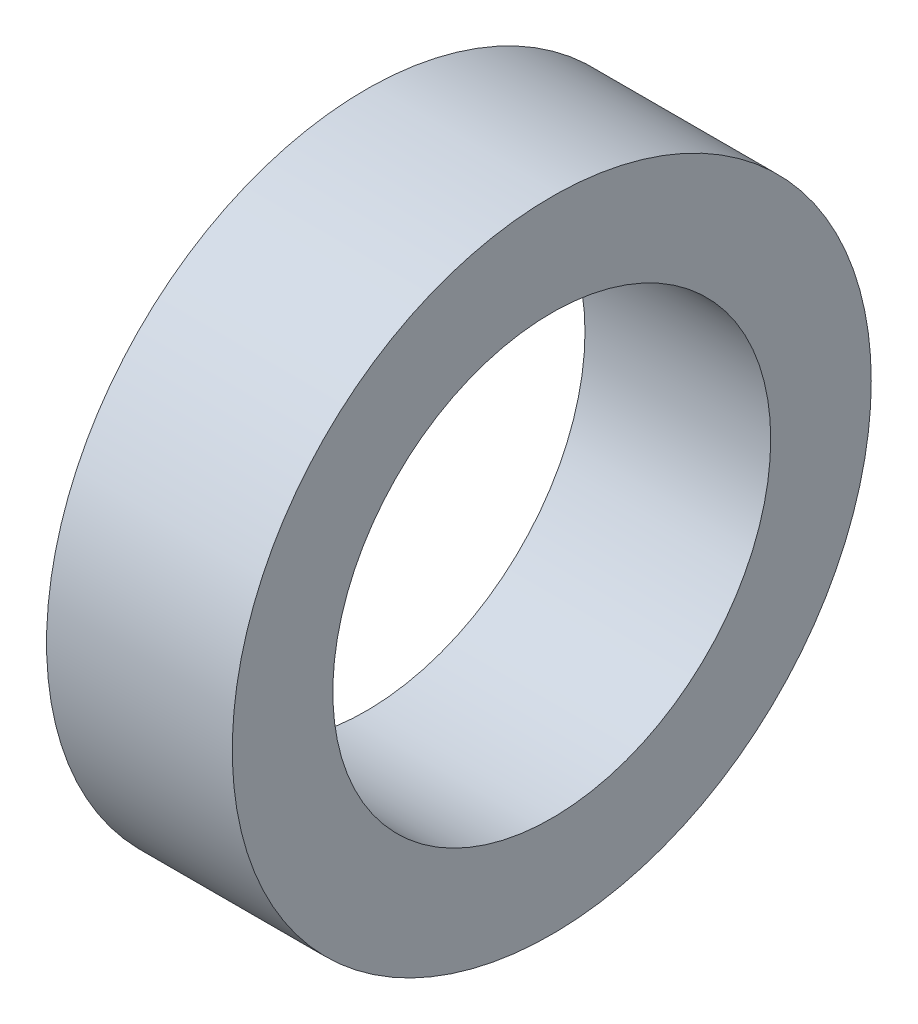
ISO-10303-21;
HEADER;
FILE_DESCRIPTION(('STEP AP214'),'2;1');
FILE_NAME('part.step','',(''),(''),'','','');
FILE_SCHEMA(('AUTOMOTIVE_DESIGN { 1 0 10303 214 1 1 1 1 }'));
ENDSEC;
DATA;
#1=APPLICATION_CONTEXT('core data for automotive mechanical design processes');
#2=APPLICATION_PROTOCOL_DEFINITION('international standard','automotive_design',2000,#1);
#3=PRODUCT_CONTEXT('',#1,'mechanical');
#4=PRODUCT('Part','Part','',(#3));
#5=PRODUCT_RELATED_PRODUCT_CATEGORY('part','',(#4));
#6=PRODUCT_DEFINITION_FORMATION('','',#4);
#7=PRODUCT_DEFINITION_CONTEXT('part definition',#1,'design');
#8=PRODUCT_DEFINITION('design','',#6,#7);
#9=PRODUCT_DEFINITION_SHAPE('','',#8);
#10=(LENGTH_UNIT() NAMED_UNIT(*) SI_UNIT(.MILLI.,.METRE.));
#11=(NAMED_UNIT(*) PLANE_ANGLE_UNIT() SI_UNIT($,.RADIAN.));
#12=(NAMED_UNIT(*) SI_UNIT($,.STERADIAN.) SOLID_ANGLE_UNIT());
#13=UNCERTAINTY_MEASURE_WITH_UNIT(LENGTH_MEASURE(1.E-05),#10,'distance_accuracy_value','');
#14=(GEOMETRIC_REPRESENTATION_CONTEXT(3) GLOBAL_UNCERTAINTY_ASSIGNED_CONTEXT((#13)) GLOBAL_UNIT_ASSIGNED_CONTEXT((#10,
#11,#12)) REPRESENTATION_CONTEXT('',''));
#15=CARTESIAN_POINT('',(0.,0.,0.));
#16=DIRECTION('',(0.,0.,1.));
#17=DIRECTION('',(1.,0.,0.));
#18=AXIS2_PLACEMENT_3D('',#15,#16,#17);
#19=CARTESIAN_POINT('',(0.,0.,0.));
#20=DIRECTION('',(1.,0.,0.));
#21=DIRECTION('',(0.,0.,-1.));
#22=AXIS2_PLACEMENT_3D('',#19,#20,#21);
#23=CYLINDRICAL_SURFACE('',#22,3.2639);
#24=CARTESIAN_POINT('',(2.7686,0.,0.));
#25=DIRECTION('',(1.,0.,0.));
#26=DIRECTION('',(0.,0.,-1.));
#27=AXIS2_PLACEMENT_3D('',#24,#25,#26);
#28=CIRCLE('',#27,3.2639);
#29=CARTESIAN_POINT('',(2.7686,0.,-3.2639));
#30=VERTEX_POINT('',#29);
#31=EDGE_CURVE('E17',#30,#30,#28,.F.);
#32=ORIENTED_EDGE('',*,*,#31,.F.);
#33=EDGE_LOOP('',(#32));
#34=FACE_BOUND('',#33,.T.);
#35=CARTESIAN_POINT('',(0.,0.,0.));
#36=DIRECTION('',(1.,0.,0.));
#37=DIRECTION('',(0.,0.,-1.));
#38=AXIS2_PLACEMENT_3D('',#35,#36,#37);
#39=CIRCLE('',#38,3.2639);
#40=CARTESIAN_POINT('',(0.,0.,-3.2639));
#41=VERTEX_POINT('',#40);
#42=EDGE_CURVE('E26',#41,#41,#39,.F.);
#43=ORIENTED_EDGE('',*,*,#42,.T.);
#44=EDGE_LOOP('',(#43));
#45=FACE_BOUND('',#44,.T.);
#46=ADVANCED_FACE('F14',(#34,#45),#23,.F.);
#47=CARTESIAN_POINT('',(2.7686,0.,0.));
#48=DIRECTION('',(1.,0.,0.));
#49=DIRECTION('',(0.,0.,-1.));
#50=AXIS2_PLACEMENT_3D('',#47,#48,#49);
#51=PLANE('',#50);
#52=ORIENTED_EDGE('',*,*,#31,.T.);
#53=EDGE_LOOP('',(#52));
#54=FACE_BOUND('',#53,.T.);
#55=CARTESIAN_POINT('',(2.7686,0.,0.));
#56=DIRECTION('',(1.,0.,0.));
#57=DIRECTION('',(0.,0.,-1.));
#58=AXIS2_PLACEMENT_3D('',#55,#56,#57);
#59=CIRCLE('',#58,4.7625);
#60=CARTESIAN_POINT('',(2.7686,0.,-4.7625));
#61=VERTEX_POINT('',#60);
#62=EDGE_CURVE('E21',#61,#61,#59,.F.);
#63=ORIENTED_EDGE('',*,*,#62,.F.);
#64=EDGE_LOOP('',(#63));
#65=FACE_BOUND('',#64,.T.);
#66=ADVANCED_FACE('F34',(#54,#65),#51,.T.);
#67=CARTESIAN_POINT('',(0.,0.,0.));
#68=DIRECTION('',(1.,0.,0.));
#69=DIRECTION('',(0.,0.,-1.));
#70=AXIS2_PLACEMENT_3D('',#67,#68,#69);
#71=PLANE('',#70);
#72=ORIENTED_EDGE('',*,*,#42,.F.);
#73=EDGE_LOOP('',(#72));
#74=FACE_BOUND('',#73,.T.);
#75=CARTESIAN_POINT('',(0.,0.,0.));
#76=DIRECTION('',(1.,0.,0.));
#77=DIRECTION('',(0.,0.,-1.));
#78=AXIS2_PLACEMENT_3D('',#75,#76,#77);
#79=CIRCLE('',#78,4.7625);
#80=CARTESIAN_POINT('',(0.,0.,-4.7625));
#81=VERTEX_POINT('',#80);
#82=EDGE_CURVE('E10',#81,#81,#79,.T.);
#83=ORIENTED_EDGE('',*,*,#82,.F.);
#84=EDGE_LOOP('',(#83));
#85=FACE_BOUND('',#84,.T.);
#86=ADVANCED_FACE('F42',(#74,#85),#71,.F.);
#87=CARTESIAN_POINT('',(0.,0.,0.));
#88=DIRECTION('',(1.,0.,0.));
#89=DIRECTION('',(0.,0.,-1.));
#90=AXIS2_PLACEMENT_3D('',#87,#88,#89);
#91=CYLINDRICAL_SURFACE('',#90,4.7625);
#92=ORIENTED_EDGE('',*,*,#62,.T.);
#93=EDGE_LOOP('',(#92));
#94=FACE_BOUND('',#93,.T.);
#95=ORIENTED_EDGE('',*,*,#82,.T.);
#96=EDGE_LOOP('',(#95));
#97=FACE_BOUND('',#96,.T.);
#98=ADVANCED_FACE('F43',(#94,#97),#91,.T.);
#99=CLOSED_SHELL('',(#46,#66,#86,#98));
#100=MANIFOLD_SOLID_BREP('B1',#99);
#101=ADVANCED_BREP_SHAPE_REPRESENTATION('',(#18,#100),#14);
#102=SHAPE_DEFINITION_REPRESENTATION(#9,#101);
ENDSEC;
END-ISO-10303-21;
